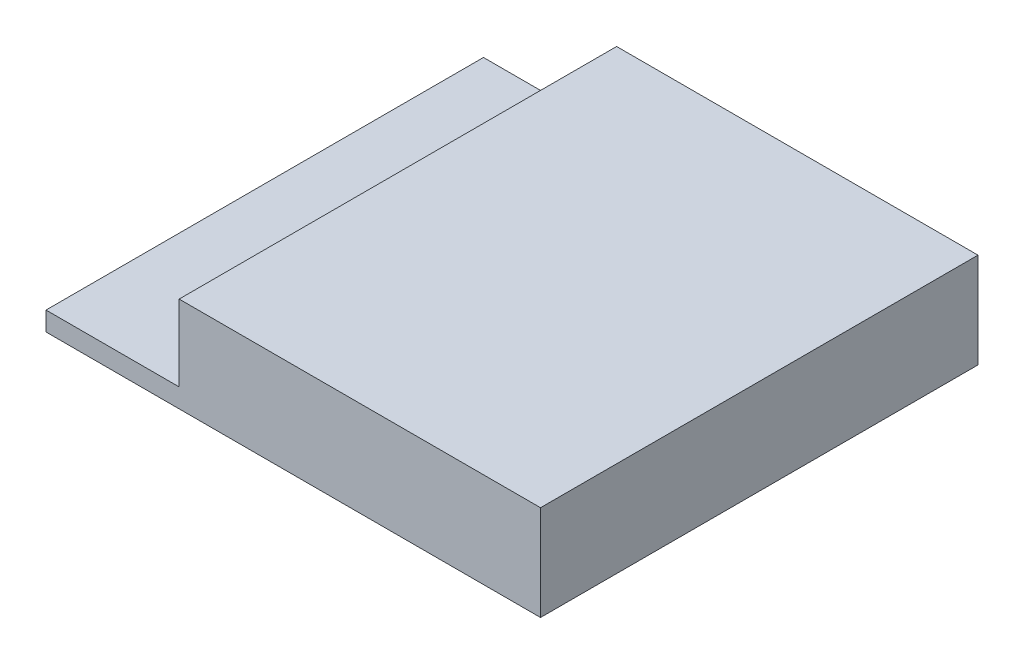
ISO-10303-21;
HEADER;
FILE_DESCRIPTION(('STEP AP214'),'2;1');
FILE_NAME('part.step','',(''),(''),'','','');
FILE_SCHEMA(('AUTOMOTIVE_DESIGN { 1 0 10303 214 1 1 1 1 }'));
ENDSEC;
DATA;
#1=APPLICATION_CONTEXT('core data for automotive mechanical design processes');
#2=APPLICATION_PROTOCOL_DEFINITION('international standard','automotive_design',2000,#1);
#3=PRODUCT_CONTEXT('',#1,'mechanical');
#4=PRODUCT('Part','Part','',(#3));
#5=PRODUCT_RELATED_PRODUCT_CATEGORY('part','',(#4));
#6=PRODUCT_DEFINITION_FORMATION('','',#4);
#7=PRODUCT_DEFINITION_CONTEXT('part definition',#1,'design');
#8=PRODUCT_DEFINITION('design','',#6,#7);
#9=PRODUCT_DEFINITION_SHAPE('','',#8);
#10=(LENGTH_UNIT() NAMED_UNIT(*) SI_UNIT(.MILLI.,.METRE.));
#11=(NAMED_UNIT(*) PLANE_ANGLE_UNIT() SI_UNIT($,.RADIAN.));
#12=(NAMED_UNIT(*) SI_UNIT($,.STERADIAN.) SOLID_ANGLE_UNIT());
#13=UNCERTAINTY_MEASURE_WITH_UNIT(LENGTH_MEASURE(1.E-05),#10,'distance_accuracy_value','');
#14=(GEOMETRIC_REPRESENTATION_CONTEXT(3) GLOBAL_UNCERTAINTY_ASSIGNED_CONTEXT((#13)) GLOBAL_UNIT_ASSIGNED_CONTEXT((#10,
#11,#12)) REPRESENTATION_CONTEXT('',''));
#15=CARTESIAN_POINT('',(0.,0.,0.));
#16=DIRECTION('',(0.,0.,1.));
#17=DIRECTION('',(1.,0.,0.));
#18=AXIS2_PLACEMENT_3D('',#15,#16,#17);
#19=CARTESIAN_POINT('',(-14.8019801980198,5.,33.3613861386139));
#20=DIRECTION('',(1.,0.,0.));
#21=DIRECTION('',(0.,0.,-1.));
#22=AXIS2_PLACEMENT_3D('',#19,#20,#21);
#23=PLANE('',#22);
#24=DIRECTION('',(0.,-1.,0.));
#25=VECTOR('',#24,1.);
#26=CARTESIAN_POINT('',(-14.8019801980198,5.,33.3613861386139));
#27=LINE('',#26,#25);
#28=CARTESIAN_POINT('',(-14.8019801980198,1.,33.3613861386139));
#29=VERTEX_POINT('',#28);
#30=CARTESIAN_POINT('',(-14.8019801980198,0.,33.3613861386139));
#31=VERTEX_POINT('',#30);
#32=EDGE_CURVE('E12',#29,#31,#27,.T.);
#33=ORIENTED_EDGE('',*,*,#32,.F.);
#34=DIRECTION('',(0.,0.,1.));
#35=VECTOR('',#34,1.);
#36=CARTESIAN_POINT('',(-14.8019801980198,1.,10.3613861386139));
#37=LINE('',#36,#35);
#38=CARTESIAN_POINT('',(-14.8019801980198,1.,10.3613861386139));
#39=VERTEX_POINT('',#38);
#40=EDGE_CURVE('E83',#39,#29,#37,.T.);
#41=ORIENTED_EDGE('',*,*,#40,.F.);
#42=DIRECTION('',(0.,-1.,0.));
#43=VECTOR('',#42,1.);
#44=CARTESIAN_POINT('',(-14.8019801980198,5.,10.3613861386139));
#45=LINE('',#44,#43);
#46=CARTESIAN_POINT('',(-14.8019801980198,0.,10.3613861386139));
#47=VERTEX_POINT('',#46);
#48=EDGE_CURVE('E76',#39,#47,#45,.T.);
#49=ORIENTED_EDGE('',*,*,#48,.T.);
#50=DIRECTION('',(0.,0.,1.));
#51=VECTOR('',#50,1.);
#52=CARTESIAN_POINT('',(-14.8019801980198,0.,33.3613861386139));
#53=LINE('',#52,#51);
#54=EDGE_CURVE('E80',#47,#31,#53,.T.);
#55=ORIENTED_EDGE('',*,*,#54,.T.);
#56=EDGE_LOOP('',(#33,#41,#49,#55));
#57=FACE_BOUND('',#56,.T.);
#58=ADVANCED_FACE('F34',(#57),#23,.F.);
#59=CARTESIAN_POINT('',(-14.8019801980198,5.,33.3613861386139));
#60=DIRECTION('',(0.,0.,-1.));
#61=DIRECTION('',(-1.,0.,0.));
#62=AXIS2_PLACEMENT_3D('',#59,#60,#61);
#63=PLANE('',#62);
#64=DIRECTION('',(0.,1.,0.));
#65=VECTOR('',#64,1.);
#66=CARTESIAN_POINT('',(-7.80198019801979,-24.0416305603426,33.3613861386139));
#67=LINE('',#66,#65);
#68=CARTESIAN_POINT('',(-7.80198019801979,1.,33.3613861386139));
#69=VERTEX_POINT('',#68);
#70=CARTESIAN_POINT('',(-7.80198019801979,5.,33.3613861386139));
#71=VERTEX_POINT('',#70);
#72=EDGE_CURVE('E48',#69,#71,#67,.T.);
#73=ORIENTED_EDGE('',*,*,#72,.F.);
#74=DIRECTION('',(1.,0.,0.));
#75=VECTOR('',#74,1.);
#76=CARTESIAN_POINT('',(-14.8019801980198,1.,33.3613861386139));
#77=LINE('',#76,#75);
#78=EDGE_CURVE('E120',#29,#69,#77,.T.);
#79=ORIENTED_EDGE('',*,*,#78,.F.);
#80=ORIENTED_EDGE('',*,*,#32,.T.);
#81=DIRECTION('',(1.,0.,0.));
#82=VECTOR('',#81,1.);
#83=CARTESIAN_POINT('',(-14.8019801980198,0.,33.3613861386139));
#84=LINE('',#83,#82);
#85=CARTESIAN_POINT('',(11.1980198019802,0.,33.3613861386139));
#86=VERTEX_POINT('',#85);
#87=EDGE_CURVE('E101',#31,#86,#84,.T.);
#88=ORIENTED_EDGE('',*,*,#87,.T.);
#89=DIRECTION('',(0.,-1.,0.));
#90=VECTOR('',#89,1.);
#91=CARTESIAN_POINT('',(11.1980198019802,5.,33.3613861386139));
#92=LINE('',#91,#90);
#93=CARTESIAN_POINT('',(11.1980198019802,5.,33.3613861386139));
#94=VERTEX_POINT('',#93);
#95=EDGE_CURVE('E41',#94,#86,#92,.T.);
#96=ORIENTED_EDGE('',*,*,#95,.F.);
#97=DIRECTION('',(1.,0.,0.));
#98=VECTOR('',#97,1.);
#99=CARTESIAN_POINT('',(-14.8019801980198,5.,33.3613861386139));
#100=LINE('',#99,#98);
#101=EDGE_CURVE('E96',#71,#94,#100,.T.);
#102=ORIENTED_EDGE('',*,*,#101,.F.);
#103=EDGE_LOOP('',(#73,#79,#80,#88,#96,#102));
#104=FACE_BOUND('',#103,.T.);
#105=ADVANCED_FACE('F116',(#104),#63,.F.);
#106=CARTESIAN_POINT('',(11.1980198019802,5.,33.3613861386139));
#107=DIRECTION('',(-1.,0.,0.));
#108=DIRECTION('',(0.,0.,1.));
#109=AXIS2_PLACEMENT_3D('',#106,#107,#108);
#110=PLANE('',#109);
#111=DIRECTION('',(0.,0.,-1.));
#112=VECTOR('',#111,1.);
#113=CARTESIAN_POINT('',(11.1980198019802,0.,33.3613861386139));
#114=LINE('',#113,#112);
#115=CARTESIAN_POINT('',(11.1980198019802,0.,10.3613861386139));
#116=VERTEX_POINT('',#115);
#117=EDGE_CURVE('E97',#86,#116,#114,.T.);
#118=ORIENTED_EDGE('',*,*,#117,.T.);
#119=DIRECTION('',(0.,-1.,0.));
#120=VECTOR('',#119,1.);
#121=CARTESIAN_POINT('',(11.1980198019802,5.,10.3613861386139));
#122=LINE('',#121,#120);
#123=CARTESIAN_POINT('',(11.1980198019802,5.,10.3613861386139));
#124=VERTEX_POINT('',#123);
#125=EDGE_CURVE('E86',#124,#116,#122,.T.);
#126=ORIENTED_EDGE('',*,*,#125,.F.);
#127=DIRECTION('',(0.,0.,-1.));
#128=VECTOR('',#127,1.);
#129=CARTESIAN_POINT('',(11.1980198019802,5.,33.3613861386139));
#130=LINE('',#129,#128);
#131=EDGE_CURVE('E57',#94,#124,#130,.T.);
#132=ORIENTED_EDGE('',*,*,#131,.F.);
#133=ORIENTED_EDGE('',*,*,#95,.T.);
#134=EDGE_LOOP('',(#118,#126,#132,#133));
#135=FACE_BOUND('',#134,.T.);
#136=ADVANCED_FACE('F113',(#135),#110,.F.);
#137=CARTESIAN_POINT('',(-14.8019801980198,5.,10.3613861386139));
#138=DIRECTION('',(0.,0.,1.));
#139=DIRECTION('',(1.,0.,0.));
#140=AXIS2_PLACEMENT_3D('',#137,#138,#139);
#141=PLANE('',#140);
#142=ORIENTED_EDGE('',*,*,#48,.F.);
#143=DIRECTION('',(-1.,0.,0.));
#144=VECTOR('',#143,1.);
#145=CARTESIAN_POINT('',(-14.8019801980198,1.,10.3613861386139));
#146=LINE('',#145,#144);
#147=CARTESIAN_POINT('',(-7.80198019801979,1.,10.3613861386139));
#148=VERTEX_POINT('',#147);
#149=EDGE_CURVE('E104',#148,#39,#146,.T.);
#150=ORIENTED_EDGE('',*,*,#149,.F.);
#151=DIRECTION('',(0.,1.,0.));
#152=VECTOR('',#151,1.);
#153=CARTESIAN_POINT('',(-7.80198019801979,-24.0416305603426,10.3613861386139));
#154=LINE('',#153,#152);
#155=CARTESIAN_POINT('',(-7.80198019801979,5.,10.3613861386139));
#156=VERTEX_POINT('',#155);
#157=EDGE_CURVE('E134',#148,#156,#154,.T.);
#158=ORIENTED_EDGE('',*,*,#157,.T.);
#159=DIRECTION('',(-1.,0.,0.));
#160=VECTOR('',#159,1.);
#161=CARTESIAN_POINT('',(-14.8019801980198,5.,10.3613861386139));
#162=LINE('',#161,#160);
#163=EDGE_CURVE('E87',#124,#156,#162,.T.);
#164=ORIENTED_EDGE('',*,*,#163,.F.);
#165=ORIENTED_EDGE('',*,*,#125,.T.);
#166=DIRECTION('',(-1.,0.,0.));
#167=VECTOR('',#166,1.);
#168=CARTESIAN_POINT('',(-14.8019801980198,0.,10.3613861386139));
#169=LINE('',#168,#167);
#170=EDGE_CURVE('E91',#116,#47,#169,.T.);
#171=ORIENTED_EDGE('',*,*,#170,.T.);
#172=EDGE_LOOP('',(#142,#150,#158,#164,#165,#171));
#173=FACE_BOUND('',#172,.T.);
#174=ADVANCED_FACE('F92',(#173),#141,.F.);
#175=CARTESIAN_POINT('',(0.,5.,0.));
#176=DIRECTION('',(0.,-1.,0.));
#177=DIRECTION('',(0.,0.,-1.));
#178=AXIS2_PLACEMENT_3D('',#175,#176,#177);
#179=PLANE('',#178);
#180=ORIENTED_EDGE('',*,*,#163,.T.);
#181=DIRECTION('',(0.,0.,-1.));
#182=VECTOR('',#181,1.);
#183=CARTESIAN_POINT('',(-7.80198019801979,5.,10.3613861386139));
#184=LINE('',#183,#182);
#185=EDGE_CURVE('E142',#71,#156,#184,.T.);
#186=ORIENTED_EDGE('',*,*,#185,.F.);
#187=ORIENTED_EDGE('',*,*,#101,.T.);
#188=ORIENTED_EDGE('',*,*,#131,.T.);
#189=EDGE_LOOP('',(#180,#186,#187,#188));
#190=FACE_BOUND('',#189,.T.);
#191=ADVANCED_FACE('F141',(#190),#179,.F.);
#192=CARTESIAN_POINT('',(0.,0.,0.));
#193=DIRECTION('',(0.,-1.,0.));
#194=DIRECTION('',(0.,0.,-1.));
#195=AXIS2_PLACEMENT_3D('',#192,#193,#194);
#196=PLANE('',#195);
#197=ORIENTED_EDGE('',*,*,#54,.F.);
#198=ORIENTED_EDGE('',*,*,#170,.F.);
#199=ORIENTED_EDGE('',*,*,#117,.F.);
#200=ORIENTED_EDGE('',*,*,#87,.F.);
#201=EDGE_LOOP('',(#197,#198,#199,#200));
#202=FACE_BOUND('',#201,.T.);
#203=ADVANCED_FACE('F100',(#202),#196,.T.);
#204=CARTESIAN_POINT('',(0.,1.,0.));
#205=DIRECTION('',(0.,-1.,0.));
#206=DIRECTION('',(0.,0.,-1.));
#207=AXIS2_PLACEMENT_3D('',#204,#205,#206);
#208=PLANE('',#207);
#209=ORIENTED_EDGE('',*,*,#40,.T.);
#210=ORIENTED_EDGE('',*,*,#78,.T.);
#211=DIRECTION('',(0.,0.,-1.));
#212=VECTOR('',#211,1.);
#213=CARTESIAN_POINT('',(-7.80198019801979,1.,10.3613861386139));
#214=LINE('',#213,#212);
#215=EDGE_CURVE('E132',#69,#148,#214,.T.);
#216=ORIENTED_EDGE('',*,*,#215,.T.);
#217=ORIENTED_EDGE('',*,*,#149,.T.);
#218=EDGE_LOOP('',(#209,#210,#216,#217));
#219=FACE_BOUND('',#218,.T.);
#220=ADVANCED_FACE('F131',(#219),#208,.F.);
#221=CARTESIAN_POINT('',(-7.80198019801979,-24.0416305603426,10.3613861386139));
#222=DIRECTION('',(1.,0.,0.));
#223=DIRECTION('',(0.,0.,-1.));
#224=AXIS2_PLACEMENT_3D('',#221,#222,#223);
#225=PLANE('',#224);
#226=ORIENTED_EDGE('',*,*,#72,.T.);
#227=ORIENTED_EDGE('',*,*,#185,.T.);
#228=ORIENTED_EDGE('',*,*,#157,.F.);
#229=ORIENTED_EDGE('',*,*,#215,.F.);
#230=EDGE_LOOP('',(#226,#227,#228,#229));
#231=FACE_BOUND('',#230,.T.);
#232=ADVANCED_FACE('F143',(#231),#225,.F.);
#233=CLOSED_SHELL('',(#58,#105,#136,#174,#191,#203,#220,#232));
#234=MANIFOLD_SOLID_BREP('B2',#233);
#235=ADVANCED_BREP_SHAPE_REPRESENTATION('',(#18,#234),#14);
#236=SHAPE_DEFINITION_REPRESENTATION(#9,#235);
ENDSEC;
END-ISO-10303-21;
